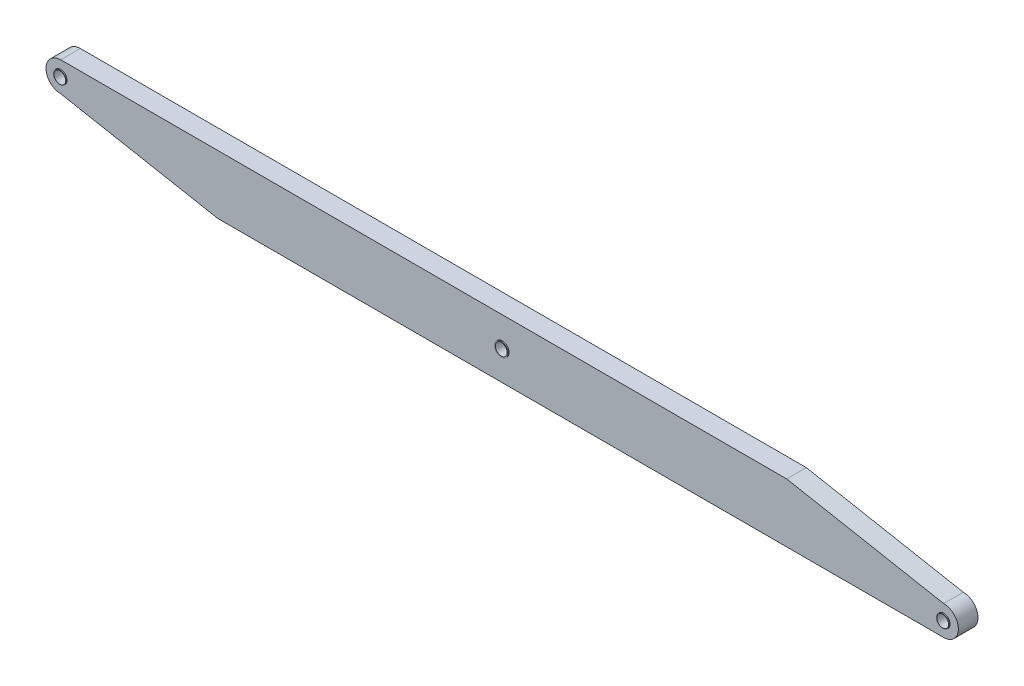
ISO-10303-21;
HEADER;
FILE_DESCRIPTION(('STEP AP214'),'2;1');
FILE_NAME('part.step','',(''),(''),'','','');
FILE_SCHEMA(('AUTOMOTIVE_DESIGN { 1 0 10303 214 1 1 1 1 }'));
ENDSEC;
DATA;
#1=APPLICATION_CONTEXT('core data for automotive mechanical design processes');
#2=APPLICATION_PROTOCOL_DEFINITION('international standard','automotive_design',2000,#1);
#3=PRODUCT_CONTEXT('',#1,'mechanical');
#4=PRODUCT('Part','Part','',(#3));
#5=PRODUCT_RELATED_PRODUCT_CATEGORY('part','',(#4));
#6=PRODUCT_DEFINITION_FORMATION('','',#4);
#7=PRODUCT_DEFINITION_CONTEXT('part definition',#1,'design');
#8=PRODUCT_DEFINITION('design','',#6,#7);
#9=PRODUCT_DEFINITION_SHAPE('','',#8);
#10=(LENGTH_UNIT() NAMED_UNIT(*) SI_UNIT(.MILLI.,.METRE.));
#11=(NAMED_UNIT(*) PLANE_ANGLE_UNIT() SI_UNIT($,.RADIAN.));
#12=(NAMED_UNIT(*) SI_UNIT($,.STERADIAN.) SOLID_ANGLE_UNIT());
#13=UNCERTAINTY_MEASURE_WITH_UNIT(LENGTH_MEASURE(1.E-05),#10,'distance_accuracy_value','');
#14=(GEOMETRIC_REPRESENTATION_CONTEXT(3) GLOBAL_UNCERTAINTY_ASSIGNED_CONTEXT((#13)) GLOBAL_UNIT_ASSIGNED_CONTEXT((#10,
#11,#12)) REPRESENTATION_CONTEXT('',''));
#15=CARTESIAN_POINT('',(0.,0.,0.));
#16=DIRECTION('',(0.,0.,1.));
#17=DIRECTION('',(1.,0.,0.));
#18=AXIS2_PLACEMENT_3D('',#15,#16,#17);
#19=CARTESIAN_POINT('',(-20.7456611294416,-18.1239708121827,0.));
#20=DIRECTION('',(0.,0.,1.));
#21=DIRECTION('',(1.,0.,0.));
#22=AXIS2_PLACEMENT_3D('',#19,#20,#21);
#23=PLANE('',#22);
#24=CARTESIAN_POINT('',(-20.7456611294416,-18.1239708121827,0.));
#25=DIRECTION('',(0.,0.,1.));
#26=DIRECTION('',(1.,0.,0.));
#27=AXIS2_PLACEMENT_3D('',#24,#25,#26);
#28=CIRCLE('',#27,11.2125);
#29=CARTESIAN_POINT('',(-9.53316112944162,-18.1239708121827,0.));
#30=VERTEX_POINT('',#29);
#31=EDGE_CURVE('E42',#30,#30,#28,.F.);
#32=ORIENTED_EDGE('',*,*,#31,.F.);
#33=EDGE_LOOP('',(#32));
#34=FACE_BOUND('',#33,.T.);
#35=CARTESIAN_POINT('',(-20.7456611294416,-18.1239708121827,0.));
#36=DIRECTION('',(0.,0.,1.));
#37=DIRECTION('',(1.,0.,0.));
#38=AXIS2_PLACEMENT_3D('',#35,#36,#37);
#39=CIRCLE('',#38,25.875);
#40=CARTESIAN_POINT('',(-20.7456611294416,7.75102918781726,0.));
#41=VERTEX_POINT('',#40);
#42=CARTESIAN_POINT('',(-20.7456611294416,-43.9989708121827,0.));
#43=VERTEX_POINT('',#42);
#44=EDGE_CURVE('E120',#41,#43,#39,.T.);
#45=ORIENTED_EDGE('',*,*,#44,.F.);
#46=DIRECTION('',(-1.,0.,0.));
#47=VECTOR('',#46,1.);
#48=CARTESIAN_POINT('',(-20.7456611294416,7.75102918781726,0.));
#49=LINE('',#48,#47);
#50=CARTESIAN_POINT('',(1255.75433887056,7.75102918781726,0.));
#51=VERTEX_POINT('',#50);
#52=EDGE_CURVE('E79',#51,#41,#49,.T.);
#53=ORIENTED_EDGE('',*,*,#52,.F.);
#54=DIRECTION('',(-0.982872186934322,0.184288535050185,0.));
#55=VECTOR('',#54,1.);
#56=CARTESIAN_POINT('',(1531.75433887056,-43.9989708121827,0.));
#57=LINE('',#56,#55);
#58=CARTESIAN_POINT('',(1531.75433887056,-43.9989708121827,0.));
#59=VERTEX_POINT('',#58);
#60=EDGE_CURVE('E73',#59,#51,#57,.T.);
#61=ORIENTED_EDGE('',*,*,#60,.F.);
#62=CARTESIAN_POINT('',(1531.75433887056,-69.8739708121827,0.));
#63=DIRECTION('',(0.,0.,1.));
#64=DIRECTION('',(1.,0.,0.));
#65=AXIS2_PLACEMENT_3D('',#62,#63,#64);
#66=CIRCLE('',#65,25.875);
#67=CARTESIAN_POINT('',(1531.75433887056,-95.7489708121827,0.));
#68=VERTEX_POINT('',#67);
#69=EDGE_CURVE('E110',#68,#59,#66,.T.);
#70=ORIENTED_EDGE('',*,*,#69,.F.);
#71=DIRECTION('',(1.,0.,0.));
#72=VECTOR('',#71,1.);
#73=CARTESIAN_POINT('',(255.254338870558,-95.7489708121827,0.));
#74=LINE('',#73,#72);
#75=CARTESIAN_POINT('',(255.254338870558,-95.7489708121827,0.));
#76=VERTEX_POINT('',#75);
#77=EDGE_CURVE('E126',#76,#68,#74,.T.);
#78=ORIENTED_EDGE('',*,*,#77,.F.);
#79=DIRECTION('',(0.982872186934322,-0.184288535050185,0.));
#80=VECTOR('',#79,1.);
#81=CARTESIAN_POINT('',(-20.7456611294416,-43.9989708121827,0.));
#82=LINE('',#81,#80);
#83=EDGE_CURVE('E123',#43,#76,#82,.T.);
#84=ORIENTED_EDGE('',*,*,#83,.F.);
#85=EDGE_LOOP('',(#45,#53,#61,#70,#78,#84));
#86=FACE_BOUND('',#85,.T.);
#87=CARTESIAN_POINT('',(1531.75433887056,-69.8739708121827,0.));
#88=DIRECTION('',(0.,0.,1.));
#89=DIRECTION('',(1.,0.,0.));
#90=AXIS2_PLACEMENT_3D('',#87,#88,#89);
#91=CIRCLE('',#90,11.2125);
#92=CARTESIAN_POINT('',(1542.96683887056,-69.8739708121827,0.));
#93=VERTEX_POINT('',#92);
#94=EDGE_CURVE('E140',#93,#93,#91,.F.);
#95=ORIENTED_EDGE('',*,*,#94,.F.);
#96=EDGE_LOOP('',(#95));
#97=FACE_BOUND('',#96,.T.);
#98=CARTESIAN_POINT('',(755.504338870558,-43.9989708121827,0.));
#99=DIRECTION('',(0.,0.,1.));
#100=DIRECTION('',(1.,0.,0.));
#101=AXIS2_PLACEMENT_3D('',#98,#99,#100);
#102=CIRCLE('',#101,12.075);
#103=CARTESIAN_POINT('',(767.579338870558,-43.9989708121827,0.));
#104=VERTEX_POINT('',#103);
#105=EDGE_CURVE('E11',#104,#104,#102,.F.);
#106=ORIENTED_EDGE('',*,*,#105,.F.);
#107=EDGE_LOOP('',(#106));
#108=FACE_BOUND('',#107,.T.);
#109=ADVANCED_FACE('F33',(#34,#86,#97,#108),#23,.F.);
#110=CARTESIAN_POINT('',(-20.7456611294416,-18.1239708121827,34.5));
#111=DIRECTION('',(0.,0.,1.));
#112=DIRECTION('',(1.,0.,0.));
#113=AXIS2_PLACEMENT_3D('',#110,#111,#112);
#114=PLANE('',#113);
#115=CARTESIAN_POINT('',(1531.75433887056,-69.8739708121827,34.5));
#116=DIRECTION('',(0.,0.,1.));
#117=DIRECTION('',(1.,0.,0.));
#118=AXIS2_PLACEMENT_3D('',#115,#116,#117);
#119=CIRCLE('',#118,11.2125);
#120=CARTESIAN_POINT('',(1542.96683887056,-69.8739708121827,34.5));
#121=VERTEX_POINT('',#120);
#122=EDGE_CURVE('E264',#121,#121,#119,.T.);
#123=ORIENTED_EDGE('',*,*,#122,.F.);
#124=EDGE_LOOP('',(#123));
#125=FACE_BOUND('',#124,.T.);
#126=CARTESIAN_POINT('',(-20.7456611294416,-18.1239708121827,34.5));
#127=DIRECTION('',(0.,0.,1.));
#128=DIRECTION('',(1.,0.,0.));
#129=AXIS2_PLACEMENT_3D('',#126,#127,#128);
#130=CIRCLE('',#129,25.875);
#131=CARTESIAN_POINT('',(-20.7456611294416,7.75102918781726,34.5));
#132=VERTEX_POINT('',#131);
#133=CARTESIAN_POINT('',(-20.7456611294416,-43.9989708121827,34.5));
#134=VERTEX_POINT('',#133);
#135=EDGE_CURVE('E131',#132,#134,#130,.T.);
#136=ORIENTED_EDGE('',*,*,#135,.T.);
#137=DIRECTION('',(0.982872186934322,-0.184288535050185,0.));
#138=VECTOR('',#137,1.);
#139=CARTESIAN_POINT('',(-20.7456611294416,-43.9989708121827,34.5));
#140=LINE('',#139,#138);
#141=CARTESIAN_POINT('',(255.254338870558,-95.7489708121827,34.5));
#142=VERTEX_POINT('',#141);
#143=EDGE_CURVE('E88',#134,#142,#140,.T.);
#144=ORIENTED_EDGE('',*,*,#143,.T.);
#145=DIRECTION('',(1.,0.,0.));
#146=VECTOR('',#145,1.);
#147=CARTESIAN_POINT('',(255.254338870558,-95.7489708121827,34.5));
#148=LINE('',#147,#146);
#149=CARTESIAN_POINT('',(1531.75433887056,-95.7489708121827,34.5));
#150=VERTEX_POINT('',#149);
#151=EDGE_CURVE('E102',#142,#150,#148,.T.);
#152=ORIENTED_EDGE('',*,*,#151,.T.);
#153=CARTESIAN_POINT('',(1531.75433887056,-69.8739708121827,34.5));
#154=DIRECTION('',(0.,0.,1.));
#155=DIRECTION('',(1.,0.,0.));
#156=AXIS2_PLACEMENT_3D('',#153,#154,#155);
#157=CIRCLE('',#156,25.875);
#158=CARTESIAN_POINT('',(1531.75433887056,-43.9989708121827,34.5));
#159=VERTEX_POINT('',#158);
#160=EDGE_CURVE('E95',#150,#159,#157,.T.);
#161=ORIENTED_EDGE('',*,*,#160,.T.);
#162=DIRECTION('',(-0.982872186934322,0.184288535050185,0.));
#163=VECTOR('',#162,1.);
#164=CARTESIAN_POINT('',(1531.75433887056,-43.9989708121827,34.5));
#165=LINE('',#164,#163);
#166=CARTESIAN_POINT('',(1255.75433887056,7.75102918781726,34.5));
#167=VERTEX_POINT('',#166);
#168=EDGE_CURVE('E100',#159,#167,#165,.T.);
#169=ORIENTED_EDGE('',*,*,#168,.T.);
#170=DIRECTION('',(-1.,0.,0.));
#171=VECTOR('',#170,1.);
#172=CARTESIAN_POINT('',(-20.7456611294416,7.75102918781726,34.5));
#173=LINE('',#172,#171);
#174=EDGE_CURVE('E50',#167,#132,#173,.T.);
#175=ORIENTED_EDGE('',*,*,#174,.T.);
#176=EDGE_LOOP('',(#136,#144,#152,#161,#169,#175));
#177=FACE_BOUND('',#176,.T.);
#178=CARTESIAN_POINT('',(-20.7456611294416,-18.1239708121827,34.5));
#179=DIRECTION('',(0.,0.,1.));
#180=DIRECTION('',(1.,0.,0.));
#181=AXIS2_PLACEMENT_3D('',#178,#179,#180);
#182=CIRCLE('',#181,11.2125);
#183=CARTESIAN_POINT('',(-9.53316112944162,-18.1239708121827,34.5));
#184=VERTEX_POINT('',#183);
#185=EDGE_CURVE('E255',#184,#184,#182,.T.);
#186=ORIENTED_EDGE('',*,*,#185,.F.);
#187=EDGE_LOOP('',(#186));
#188=FACE_BOUND('',#187,.T.);
#189=CARTESIAN_POINT('',(755.504338870558,-43.9989708121827,34.5));
#190=DIRECTION('',(0.,0.,1.));
#191=DIRECTION('',(1.,0.,0.));
#192=AXIS2_PLACEMENT_3D('',#189,#190,#191);
#193=CIRCLE('',#192,12.075);
#194=CARTESIAN_POINT('',(767.579338870558,-43.9989708121827,34.5));
#195=VERTEX_POINT('',#194);
#196=EDGE_CURVE('E273',#195,#195,#193,.T.);
#197=ORIENTED_EDGE('',*,*,#196,.F.);
#198=EDGE_LOOP('',(#197));
#199=FACE_BOUND('',#198,.T.);
#200=ADVANCED_FACE('F97',(#125,#177,#188,#199),#114,.T.);
#201=CARTESIAN_POINT('',(-20.7456611294416,-18.1239708121827,34.5));
#202=DIRECTION('',(0.,0.,-1.));
#203=DIRECTION('',(-1.,0.,0.));
#204=AXIS2_PLACEMENT_3D('',#201,#202,#203);
#205=CYLINDRICAL_SURFACE('',#204,25.875);
#206=ORIENTED_EDGE('',*,*,#44,.T.);
#207=DIRECTION('',(0.,0.,-1.));
#208=VECTOR('',#207,1.);
#209=CARTESIAN_POINT('',(-20.7456611294416,-43.9989708121827,34.5));
#210=LINE('',#209,#208);
#211=EDGE_CURVE('E138',#134,#43,#210,.T.);
#212=ORIENTED_EDGE('',*,*,#211,.F.);
#213=ORIENTED_EDGE('',*,*,#135,.F.);
#214=DIRECTION('',(0.,0.,-1.));
#215=VECTOR('',#214,1.);
#216=CARTESIAN_POINT('',(-20.7456611294416,7.75102918781726,34.5));
#217=LINE('',#216,#215);
#218=EDGE_CURVE('E116',#132,#41,#217,.T.);
#219=ORIENTED_EDGE('',*,*,#218,.T.);
#220=EDGE_LOOP('',(#206,#212,#213,#219));
#221=FACE_BOUND('',#220,.T.);
#222=ADVANCED_FACE('F35',(#221),#205,.T.);
#223=CARTESIAN_POINT('',(-20.7456611294416,-43.9989708121827,34.5));
#224=DIRECTION('',(0.184288535050185,0.982872186934322,0.));
#225=DIRECTION('',(-0.982872186934322,0.184288535050185,0.));
#226=AXIS2_PLACEMENT_3D('',#223,#224,#225);
#227=PLANE('',#226);
#228=ORIENTED_EDGE('',*,*,#83,.T.);
#229=DIRECTION('',(0.,0.,-1.));
#230=VECTOR('',#229,1.);
#231=CARTESIAN_POINT('',(255.254338870558,-95.7489708121827,34.5));
#232=LINE('',#231,#230);
#233=EDGE_CURVE('E135',#142,#76,#232,.T.);
#234=ORIENTED_EDGE('',*,*,#233,.F.);
#235=ORIENTED_EDGE('',*,*,#143,.F.);
#236=ORIENTED_EDGE('',*,*,#211,.T.);
#237=EDGE_LOOP('',(#228,#234,#235,#236));
#238=FACE_BOUND('',#237,.T.);
#239=ADVANCED_FACE('F231',(#238),#227,.F.);
#240=CARTESIAN_POINT('',(255.254338870558,-95.7489708121827,34.5));
#241=DIRECTION('',(0.,1.,0.));
#242=DIRECTION('',(0.,0.,1.));
#243=AXIS2_PLACEMENT_3D('',#240,#241,#242);
#244=PLANE('',#243);
#245=ORIENTED_EDGE('',*,*,#77,.T.);
#246=DIRECTION('',(0.,0.,-1.));
#247=VECTOR('',#246,1.);
#248=CARTESIAN_POINT('',(1531.75433887056,-95.7489708121827,34.5));
#249=LINE('',#248,#247);
#250=EDGE_CURVE('E111',#150,#68,#249,.T.);
#251=ORIENTED_EDGE('',*,*,#250,.F.);
#252=ORIENTED_EDGE('',*,*,#151,.F.);
#253=ORIENTED_EDGE('',*,*,#233,.T.);
#254=EDGE_LOOP('',(#245,#251,#252,#253));
#255=FACE_BOUND('',#254,.T.);
#256=ADVANCED_FACE('F229',(#255),#244,.F.);
#257=CARTESIAN_POINT('',(1531.75433887056,-69.8739708121827,34.5));
#258=DIRECTION('',(0.,0.,-1.));
#259=DIRECTION('',(-1.,0.,0.));
#260=AXIS2_PLACEMENT_3D('',#257,#258,#259);
#261=CYLINDRICAL_SURFACE('',#260,25.875);
#262=ORIENTED_EDGE('',*,*,#69,.T.);
#263=DIRECTION('',(0.,0.,-1.));
#264=VECTOR('',#263,1.);
#265=CARTESIAN_POINT('',(1531.75433887056,-43.9989708121827,34.5));
#266=LINE('',#265,#264);
#267=EDGE_CURVE('E107',#159,#59,#266,.T.);
#268=ORIENTED_EDGE('',*,*,#267,.F.);
#269=ORIENTED_EDGE('',*,*,#160,.F.);
#270=ORIENTED_EDGE('',*,*,#250,.T.);
#271=EDGE_LOOP('',(#262,#268,#269,#270));
#272=FACE_BOUND('',#271,.T.);
#273=ADVANCED_FACE('F108',(#272),#261,.T.);
#274=CARTESIAN_POINT('',(1531.75433887056,-43.9989708121827,34.5));
#275=DIRECTION('',(-0.184288535050185,-0.982872186934322,0.));
#276=DIRECTION('',(0.982872186934322,-0.184288535050185,0.));
#277=AXIS2_PLACEMENT_3D('',#274,#275,#276);
#278=PLANE('',#277);
#279=ORIENTED_EDGE('',*,*,#60,.T.);
#280=DIRECTION('',(0.,0.,-1.));
#281=VECTOR('',#280,1.);
#282=CARTESIAN_POINT('',(1255.75433887056,7.75102918781726,34.5));
#283=LINE('',#282,#281);
#284=EDGE_CURVE('E112',#167,#51,#283,.T.);
#285=ORIENTED_EDGE('',*,*,#284,.F.);
#286=ORIENTED_EDGE('',*,*,#168,.F.);
#287=ORIENTED_EDGE('',*,*,#267,.T.);
#288=EDGE_LOOP('',(#279,#285,#286,#287));
#289=FACE_BOUND('',#288,.T.);
#290=ADVANCED_FACE('F114',(#289),#278,.F.);
#291=CARTESIAN_POINT('',(-20.7456611294416,7.75102918781726,34.5));
#292=DIRECTION('',(0.,-1.,0.));
#293=DIRECTION('',(1.,0.,0.));
#294=AXIS2_PLACEMENT_3D('',#291,#292,#293);
#295=PLANE('',#294);
#296=ORIENTED_EDGE('',*,*,#52,.T.);
#297=ORIENTED_EDGE('',*,*,#218,.F.);
#298=ORIENTED_EDGE('',*,*,#174,.F.);
#299=ORIENTED_EDGE('',*,*,#284,.T.);
#300=EDGE_LOOP('',(#296,#297,#298,#299));
#301=FACE_BOUND('',#300,.T.);
#302=ADVANCED_FACE('F218',(#301),#295,.F.);
#303=CARTESIAN_POINT('',(-20.7456611294416,-18.1239708121827,0.));
#304=DIRECTION('',(0.,0.,1.));
#305=DIRECTION('',(1.,0.,0.));
#306=AXIS2_PLACEMENT_3D('',#303,#304,#305);
#307=CYLINDRICAL_SURFACE('',#306,10.35);
#308=CARTESIAN_POINT('',(-20.7456611294416,-18.1239708121827,-1.725));
#309=DIRECTION('',(0.,0.,-1.));
#310=DIRECTION('',(-1.,0.,0.));
#311=AXIS2_PLACEMENT_3D('',#308,#309,#310);
#312=CIRCLE('',#311,10.35);
#313=CARTESIAN_POINT('',(-31.0956611294416,-18.1239708121827,-1.725));
#314=VERTEX_POINT('',#313);
#315=EDGE_CURVE('E251',#314,#314,#312,.T.);
#316=ORIENTED_EDGE('',*,*,#315,.T.);
#317=EDGE_LOOP('',(#316));
#318=FACE_BOUND('',#317,.T.);
#319=CARTESIAN_POINT('',(-20.7456611294416,-18.1239708121827,36.225));
#320=DIRECTION('',(0.,0.,1.));
#321=DIRECTION('',(1.,0.,0.));
#322=AXIS2_PLACEMENT_3D('',#319,#320,#321);
#323=CIRCLE('',#322,10.35);
#324=CARTESIAN_POINT('',(-10.3956611294416,-18.1239708121827,36.225));
#325=VERTEX_POINT('',#324);
#326=EDGE_CURVE('E258',#325,#325,#323,.T.);
#327=ORIENTED_EDGE('',*,*,#326,.T.);
#328=EDGE_LOOP('',(#327));
#329=FACE_BOUND('',#328,.T.);
#330=ADVANCED_FACE('F214',(#318,#329),#307,.F.);
#331=CARTESIAN_POINT('',(1531.75433887056,-69.8739708121827,0.));
#332=DIRECTION('',(0.,0.,1.));
#333=DIRECTION('',(1.,0.,0.));
#334=AXIS2_PLACEMENT_3D('',#331,#332,#333);
#335=CYLINDRICAL_SURFACE('',#334,10.3499999999999);
#336=CARTESIAN_POINT('',(1531.75433887056,-69.8739708121827,-1.725));
#337=DIRECTION('',(0.,0.,-1.));
#338=DIRECTION('',(-1.,0.,0.));
#339=AXIS2_PLACEMENT_3D('',#336,#337,#338);
#340=CIRCLE('',#339,10.35);
#341=CARTESIAN_POINT('',(1521.40433887056,-69.8739708121827,-1.725));
#342=VERTEX_POINT('',#341);
#343=EDGE_CURVE('E245',#342,#342,#340,.T.);
#344=ORIENTED_EDGE('',*,*,#343,.T.);
#345=EDGE_LOOP('',(#344));
#346=FACE_BOUND('',#345,.T.);
#347=CARTESIAN_POINT('',(1531.75433887056,-69.8739708121827,36.225));
#348=DIRECTION('',(0.,0.,1.));
#349=DIRECTION('',(1.,0.,0.));
#350=AXIS2_PLACEMENT_3D('',#347,#348,#349);
#351=CIRCLE('',#350,10.35);
#352=CARTESIAN_POINT('',(1542.10433887056,-69.8739708121827,36.225));
#353=VERTEX_POINT('',#352);
#354=EDGE_CURVE('E267',#353,#353,#351,.T.);
#355=ORIENTED_EDGE('',*,*,#354,.T.);
#356=EDGE_LOOP('',(#355));
#357=FACE_BOUND('',#356,.T.);
#358=ADVANCED_FACE('F207',(#346,#357),#335,.F.);
#359=CARTESIAN_POINT('',(1531.75433887056,-69.8739708121827,-1.725));
#360=DIRECTION('',(0.,0.,-1.));
#361=DIRECTION('',(-1.,0.,0.));
#362=AXIS2_PLACEMENT_3D('',#359,#360,#361);
#363=PLANE('',#362);
#364=CARTESIAN_POINT('',(1531.75433887056,-69.8739708121827,-1.725));
#365=DIRECTION('',(0.,0.,-1.));
#366=DIRECTION('',(-1.,0.,0.));
#367=AXIS2_PLACEMENT_3D('',#364,#365,#366);
#368=CIRCLE('',#367,11.2125);
#369=CARTESIAN_POINT('',(1520.54183887056,-69.8739708121827,-1.725));
#370=VERTEX_POINT('',#369);
#371=EDGE_CURVE('E124',#370,#370,#368,.T.);
#372=ORIENTED_EDGE('',*,*,#371,.T.);
#373=EDGE_LOOP('',(#372));
#374=FACE_BOUND('',#373,.T.);
#375=ORIENTED_EDGE('',*,*,#343,.F.);
#376=EDGE_LOOP('',(#375));
#377=FACE_BOUND('',#376,.T.);
#378=ADVANCED_FACE('F204',(#374,#377),#363,.T.);
#379=CARTESIAN_POINT('',(1531.75433887056,-69.8739708121827,-1.725));
#380=DIRECTION('',(0.,0.,1.));
#381=DIRECTION('',(1.,0.,0.));
#382=AXIS2_PLACEMENT_3D('',#379,#380,#381);
#383=CYLINDRICAL_SURFACE('',#382,11.2125);
#384=ORIENTED_EDGE('',*,*,#371,.F.);
#385=EDGE_LOOP('',(#384));
#386=FACE_BOUND('',#385,.T.);
#387=ORIENTED_EDGE('',*,*,#94,.T.);
#388=EDGE_LOOP('',(#387));
#389=FACE_BOUND('',#388,.T.);
#390=ADVANCED_FACE('F199',(#386,#389),#383,.T.);
#391=CARTESIAN_POINT('',(-20.7456611294416,-18.1239708121827,-1.725));
#392=DIRECTION('',(0.,0.,-1.));
#393=DIRECTION('',(-1.,0.,0.));
#394=AXIS2_PLACEMENT_3D('',#391,#392,#393);
#395=PLANE('',#394);
#396=CARTESIAN_POINT('',(-20.7456611294416,-18.1239708121827,-1.725));
#397=DIRECTION('',(0.,0.,-1.));
#398=DIRECTION('',(-1.,0.,0.));
#399=AXIS2_PLACEMENT_3D('',#396,#397,#398);
#400=CIRCLE('',#399,11.2125);
#401=CARTESIAN_POINT('',(-31.9581611294416,-18.1239708121827,-1.725));
#402=VERTEX_POINT('',#401);
#403=EDGE_CURVE('E248',#402,#402,#400,.T.);
#404=ORIENTED_EDGE('',*,*,#403,.T.);
#405=EDGE_LOOP('',(#404));
#406=FACE_BOUND('',#405,.T.);
#407=ORIENTED_EDGE('',*,*,#315,.F.);
#408=EDGE_LOOP('',(#407));
#409=FACE_BOUND('',#408,.T.);
#410=ADVANCED_FACE('F196',(#406,#409),#395,.T.);
#411=CARTESIAN_POINT('',(-20.7456611294416,-18.1239708121827,-1.725));
#412=DIRECTION('',(0.,0.,1.));
#413=DIRECTION('',(1.,0.,0.));
#414=AXIS2_PLACEMENT_3D('',#411,#412,#413);
#415=CYLINDRICAL_SURFACE('',#414,11.2125);
#416=ORIENTED_EDGE('',*,*,#403,.F.);
#417=EDGE_LOOP('',(#416));
#418=FACE_BOUND('',#417,.T.);
#419=ORIENTED_EDGE('',*,*,#31,.T.);
#420=EDGE_LOOP('',(#419));
#421=FACE_BOUND('',#420,.T.);
#422=ADVANCED_FACE('F145',(#418,#421),#415,.T.);
#423=CARTESIAN_POINT('',(-20.7456611294416,-18.1239708121827,36.225));
#424=DIRECTION('',(0.,0.,1.));
#425=DIRECTION('',(1.,0.,0.));
#426=AXIS2_PLACEMENT_3D('',#423,#424,#425);
#427=PLANE('',#426);
#428=CARTESIAN_POINT('',(-20.7456611294416,-18.1239708121827,36.225));
#429=DIRECTION('',(0.,0.,1.));
#430=DIRECTION('',(1.,0.,0.));
#431=AXIS2_PLACEMENT_3D('',#428,#429,#430);
#432=CIRCLE('',#431,11.2125);
#433=CARTESIAN_POINT('',(-9.53316112944162,-18.1239708121827,36.225));
#434=VERTEX_POINT('',#433);
#435=EDGE_CURVE('E254',#434,#434,#432,.T.);
#436=ORIENTED_EDGE('',*,*,#435,.T.);
#437=EDGE_LOOP('',(#436));
#438=FACE_BOUND('',#437,.T.);
#439=ORIENTED_EDGE('',*,*,#326,.F.);
#440=EDGE_LOOP('',(#439));
#441=FACE_BOUND('',#440,.T.);
#442=ADVANCED_FACE('F189',(#438,#441),#427,.T.);
#443=CARTESIAN_POINT('',(-20.7456611294416,-18.1239708121827,36.225));
#444=DIRECTION('',(0.,0.,-1.));
#445=DIRECTION('',(-1.,0.,0.));
#446=AXIS2_PLACEMENT_3D('',#443,#444,#445);
#447=CYLINDRICAL_SURFACE('',#446,11.2125);
#448=ORIENTED_EDGE('',*,*,#435,.F.);
#449=EDGE_LOOP('',(#448));
#450=FACE_BOUND('',#449,.T.);
#451=ORIENTED_EDGE('',*,*,#185,.T.);
#452=EDGE_LOOP('',(#451));
#453=FACE_BOUND('',#452,.T.);
#454=ADVANCED_FACE('F184',(#450,#453),#447,.T.);
#455=CARTESIAN_POINT('',(1531.75433887056,-69.8739708121827,36.225));
#456=DIRECTION('',(0.,0.,1.));
#457=DIRECTION('',(1.,0.,0.));
#458=AXIS2_PLACEMENT_3D('',#455,#456,#457);
#459=PLANE('',#458);
#460=CARTESIAN_POINT('',(1531.75433887056,-69.8739708121827,36.225));
#461=DIRECTION('',(0.,0.,1.));
#462=DIRECTION('',(1.,0.,0.));
#463=AXIS2_PLACEMENT_3D('',#460,#461,#462);
#464=CIRCLE('',#463,11.2125);
#465=CARTESIAN_POINT('',(1542.96683887056,-69.8739708121827,36.225));
#466=VERTEX_POINT('',#465);
#467=EDGE_CURVE('E263',#466,#466,#464,.T.);
#468=ORIENTED_EDGE('',*,*,#467,.T.);
#469=EDGE_LOOP('',(#468));
#470=FACE_BOUND('',#469,.T.);
#471=ORIENTED_EDGE('',*,*,#354,.F.);
#472=EDGE_LOOP('',(#471));
#473=FACE_BOUND('',#472,.T.);
#474=ADVANCED_FACE('F181',(#470,#473),#459,.T.);
#475=CARTESIAN_POINT('',(1531.75433887056,-69.8739708121827,36.225));
#476=DIRECTION('',(0.,0.,-1.));
#477=DIRECTION('',(-1.,0.,0.));
#478=AXIS2_PLACEMENT_3D('',#475,#476,#477);
#479=CYLINDRICAL_SURFACE('',#478,11.2125);
#480=ORIENTED_EDGE('',*,*,#467,.F.);
#481=EDGE_LOOP('',(#480));
#482=FACE_BOUND('',#481,.T.);
#483=ORIENTED_EDGE('',*,*,#122,.T.);
#484=EDGE_LOOP('',(#483));
#485=FACE_BOUND('',#484,.T.);
#486=ADVANCED_FACE('F179',(#482,#485),#479,.T.);
#487=CARTESIAN_POINT('',(755.504338870558,-43.9989708121827,190.44));
#488=DIRECTION('',(0.,0.,-1.));
#489=DIRECTION('',(-1.,0.,0.));
#490=AXIS2_PLACEMENT_3D('',#487,#488,#489);
#491=CYLINDRICAL_SURFACE('',#490,10.3500000000001);
#492=CARTESIAN_POINT('',(755.504338870558,-43.9989708121827,36.225));
#493=DIRECTION('',(0.,0.,1.));
#494=DIRECTION('',(1.,0.,0.));
#495=AXIS2_PLACEMENT_3D('',#492,#493,#494);
#496=CIRCLE('',#495,10.3500000000001);
#497=CARTESIAN_POINT('',(765.854338870558,-43.9989708121827,36.225));
#498=VERTEX_POINT('',#497);
#499=EDGE_CURVE('E276',#498,#498,#496,.T.);
#500=ORIENTED_EDGE('',*,*,#499,.T.);
#501=EDGE_LOOP('',(#500));
#502=FACE_BOUND('',#501,.T.);
#503=CARTESIAN_POINT('',(755.504338870558,-43.9989708121827,-1.725));
#504=DIRECTION('',(0.,0.,-1.));
#505=DIRECTION('',(-1.,0.,0.));
#506=AXIS2_PLACEMENT_3D('',#503,#504,#505);
#507=CIRCLE('',#506,10.3500000000001);
#508=CARTESIAN_POINT('',(745.154338870558,-43.9989708121827,-1.725));
#509=VERTEX_POINT('',#508);
#510=EDGE_CURVE('E284',#509,#509,#507,.T.);
#511=ORIENTED_EDGE('',*,*,#510,.T.);
#512=EDGE_LOOP('',(#511));
#513=FACE_BOUND('',#512,.T.);
#514=ADVANCED_FACE('F172',(#502,#513),#491,.F.);
#515=CARTESIAN_POINT('',(755.504338870558,-43.9989708121827,36.225));
#516=DIRECTION('',(0.,0.,1.));
#517=DIRECTION('',(1.,0.,0.));
#518=AXIS2_PLACEMENT_3D('',#515,#516,#517);
#519=PLANE('',#518);
#520=CARTESIAN_POINT('',(755.504338870558,-43.9989708121827,36.225));
#521=DIRECTION('',(0.,0.,1.));
#522=DIRECTION('',(1.,0.,0.));
#523=AXIS2_PLACEMENT_3D('',#520,#521,#522);
#524=CIRCLE('',#523,12.075);
#525=CARTESIAN_POINT('',(767.579338870558,-43.9989708121827,36.225));
#526=VERTEX_POINT('',#525);
#527=EDGE_CURVE('E272',#526,#526,#524,.T.);
#528=ORIENTED_EDGE('',*,*,#527,.T.);
#529=EDGE_LOOP('',(#528));
#530=FACE_BOUND('',#529,.T.);
#531=ORIENTED_EDGE('',*,*,#499,.F.);
#532=EDGE_LOOP('',(#531));
#533=FACE_BOUND('',#532,.T.);
#534=ADVANCED_FACE('F169',(#530,#533),#519,.T.);
#535=CARTESIAN_POINT('',(755.504338870558,-43.9989708121827,36.225));
#536=DIRECTION('',(0.,0.,-1.));
#537=DIRECTION('',(-1.,0.,0.));
#538=AXIS2_PLACEMENT_3D('',#535,#536,#537);
#539=CYLINDRICAL_SURFACE('',#538,12.075);
#540=ORIENTED_EDGE('',*,*,#527,.F.);
#541=EDGE_LOOP('',(#540));
#542=FACE_BOUND('',#541,.T.);
#543=ORIENTED_EDGE('',*,*,#196,.T.);
#544=EDGE_LOOP('',(#543));
#545=FACE_BOUND('',#544,.T.);
#546=ADVANCED_FACE('F164',(#542,#545),#539,.T.);
#547=CARTESIAN_POINT('',(755.504338870558,-43.9989708121827,-1.725));
#548=DIRECTION('',(0.,0.,-1.));
#549=DIRECTION('',(-1.,0.,0.));
#550=AXIS2_PLACEMENT_3D('',#547,#548,#549);
#551=PLANE('',#550);
#552=CARTESIAN_POINT('',(755.504338870558,-43.9989708121827,-1.725));
#553=DIRECTION('',(0.,0.,-1.));
#554=DIRECTION('',(-1.,0.,0.));
#555=AXIS2_PLACEMENT_3D('',#552,#553,#554);
#556=CIRCLE('',#555,12.075);
#557=CARTESIAN_POINT('',(743.429338870558,-43.9989708121827,-1.725));
#558=VERTEX_POINT('',#557);
#559=EDGE_CURVE('E281',#558,#558,#556,.T.);
#560=ORIENTED_EDGE('',*,*,#559,.T.);
#561=EDGE_LOOP('',(#560));
#562=FACE_BOUND('',#561,.T.);
#563=ORIENTED_EDGE('',*,*,#510,.F.);
#564=EDGE_LOOP('',(#563));
#565=FACE_BOUND('',#564,.T.);
#566=ADVANCED_FACE('F158',(#562,#565),#551,.T.);
#567=CARTESIAN_POINT('',(755.504338870558,-43.9989708121827,-1.725));
#568=DIRECTION('',(0.,0.,1.));
#569=DIRECTION('',(1.,0.,0.));
#570=AXIS2_PLACEMENT_3D('',#567,#568,#569);
#571=CYLINDRICAL_SURFACE('',#570,12.075);
#572=ORIENTED_EDGE('',*,*,#559,.F.);
#573=EDGE_LOOP('',(#572));
#574=FACE_BOUND('',#573,.T.);
#575=ORIENTED_EDGE('',*,*,#105,.T.);
#576=EDGE_LOOP('',(#575));
#577=FACE_BOUND('',#576,.T.);
#578=ADVANCED_FACE('F156',(#574,#577),#571,.T.);
#579=CLOSED_SHELL('',(#109,#200,#222,#239,#256,#273,#290,#302,#330,#358,#378,#390,#410,#422,
#442,#454,#474,#486,#514,#534,#546,#566,#578));
#580=MANIFOLD_SOLID_BREP('B2',#579);
#581=ADVANCED_BREP_SHAPE_REPRESENTATION('',(#18,#580),#14);
#582=SHAPE_DEFINITION_REPRESENTATION(#9,#581);
ENDSEC;
END-ISO-10303-21;
